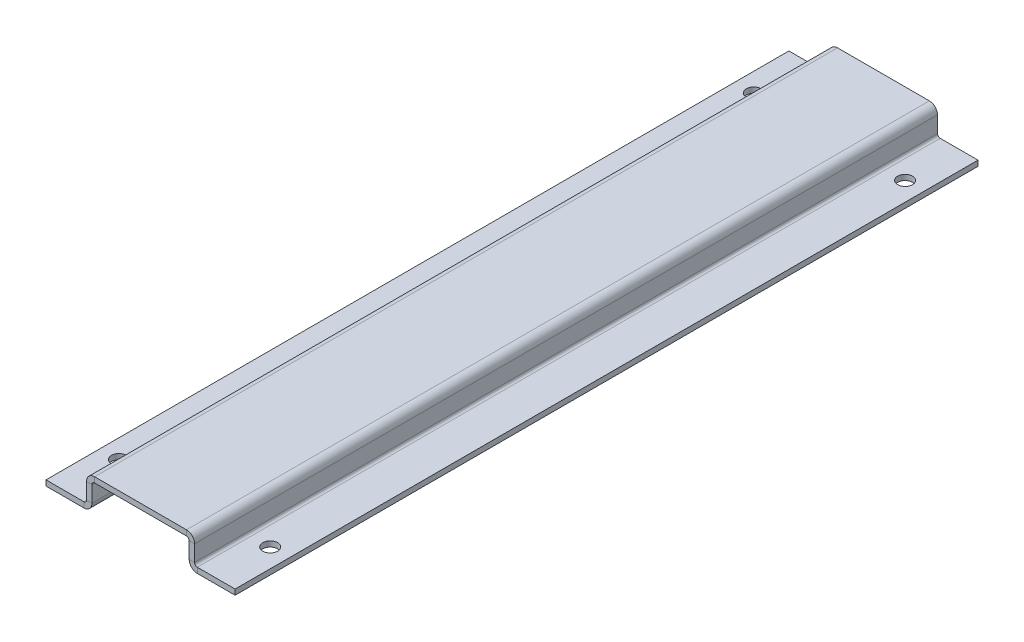
ISO-10303-21;
HEADER;
FILE_DESCRIPTION(('STEP AP214'),'2;1');
FILE_NAME('part.step','',(''),(''),'','','');
FILE_SCHEMA(('AUTOMOTIVE_DESIGN { 1 0 10303 214 1 1 1 1 }'));
ENDSEC;
DATA;
#1=APPLICATION_CONTEXT('core data for automotive mechanical design processes');
#2=APPLICATION_PROTOCOL_DEFINITION('international standard','automotive_design',2000,#1);
#3=PRODUCT_CONTEXT('',#1,'mechanical');
#4=PRODUCT('Part','Part','',(#3));
#5=PRODUCT_RELATED_PRODUCT_CATEGORY('part','',(#4));
#6=PRODUCT_DEFINITION_FORMATION('','',#4);
#7=PRODUCT_DEFINITION_CONTEXT('part definition',#1,'design');
#8=PRODUCT_DEFINITION('design','',#6,#7);
#9=PRODUCT_DEFINITION_SHAPE('','',#8);
#10=(LENGTH_UNIT() NAMED_UNIT(*) SI_UNIT(.MILLI.,.METRE.));
#11=(NAMED_UNIT(*) PLANE_ANGLE_UNIT() SI_UNIT($,.RADIAN.));
#12=(NAMED_UNIT(*) SI_UNIT($,.STERADIAN.) SOLID_ANGLE_UNIT());
#13=UNCERTAINTY_MEASURE_WITH_UNIT(LENGTH_MEASURE(1.E-05),#10,'distance_accuracy_value','');
#14=(GEOMETRIC_REPRESENTATION_CONTEXT(3) GLOBAL_UNCERTAINTY_ASSIGNED_CONTEXT((#13)) GLOBAL_UNIT_ASSIGNED_CONTEXT((#10,
#11,#12)) REPRESENTATION_CONTEXT('',''));
#15=CARTESIAN_POINT('',(0.,0.,0.));
#16=DIRECTION('',(0.,0.,1.));
#17=DIRECTION('',(1.,0.,0.));
#18=AXIS2_PLACEMENT_3D('',#15,#16,#17);
#19=CARTESIAN_POINT('',(34.9999999999999,550.712266070041,275.));
#20=DIRECTION('',(-1.,0.,0.));
#21=DIRECTION('',(0.,-1.,0.));
#22=AXIS2_PLACEMENT_3D('',#19,#20,#21);
#23=PLANE('',#22);
#24=DIRECTION('',(0.,-1.,0.));
#25=VECTOR('',#24,1.);
#26=CARTESIAN_POINT('',(34.9999999999999,550.712266070041,275.));
#27=LINE('',#26,#25);
#28=CARTESIAN_POINT('',(35.,0.,275.));
#29=VERTEX_POINT('',#28);
#30=CARTESIAN_POINT('',(35.,-2.,275.));
#31=VERTEX_POINT('',#30);
#32=EDGE_CURVE('E286',#29,#31,#27,.T.);
#33=ORIENTED_EDGE('',*,*,#32,.T.);
#34=DIRECTION('',(0.,0.,-1.));
#35=VECTOR('',#34,1.);
#36=CARTESIAN_POINT('',(35.,-2.,275.));
#37=LINE('',#36,#35);
#38=CARTESIAN_POINT('',(35.,-2.,0.));
#39=VERTEX_POINT('',#38);
#40=EDGE_CURVE('E283',#31,#39,#37,.T.);
#41=ORIENTED_EDGE('',*,*,#40,.T.);
#42=DIRECTION('',(0.,-1.,0.));
#43=VECTOR('',#42,1.);
#44=CARTESIAN_POINT('',(34.9999999999999,550.712266070041,0.));
#45=LINE('',#44,#43);
#46=CARTESIAN_POINT('',(35.,0.,0.));
#47=VERTEX_POINT('',#46);
#48=EDGE_CURVE('E271',#47,#39,#45,.T.);
#49=ORIENTED_EDGE('',*,*,#48,.F.);
#50=DIRECTION('',(0.,0.,-1.));
#51=VECTOR('',#50,1.);
#52=CARTESIAN_POINT('',(35.,0.,275.));
#53=LINE('',#52,#51);
#54=EDGE_CURVE('E11',#29,#47,#53,.T.);
#55=ORIENTED_EDGE('',*,*,#54,.F.);
#56=EDGE_LOOP('',(#33,#41,#49,#55));
#57=FACE_BOUND('',#56,.T.);
#58=ADVANCED_FACE('F36',(#57),#23,.F.);
#59=CARTESIAN_POINT('',(19.9999999999999,550.712266070041,275.));
#60=DIRECTION('',(0.,0.,-1.));
#61=DIRECTION('',(-1.,0.,0.));
#62=AXIS2_PLACEMENT_3D('',#59,#60,#61);
#63=PLANE('',#62);
#64=DIRECTION('',(0.,-1.,0.));
#65=VECTOR('',#64,1.);
#66=CARTESIAN_POINT('',(20.9999999999999,550.712266070041,275.));
#67=LINE('',#66,#65);
#68=CARTESIAN_POINT('',(21.,0.,275.));
#69=VERTEX_POINT('',#68);
#70=CARTESIAN_POINT('',(20.9999999999998,-2.00000000000001,275.));
#71=VERTEX_POINT('',#70);
#72=EDGE_CURVE('E281',#69,#71,#67,.T.);
#73=ORIENTED_EDGE('',*,*,#72,.T.);
#74=DIRECTION('',(1.,0.,0.));
#75=VECTOR('',#74,1.);
#76=CARTESIAN_POINT('',(20.,-2.,275.));
#77=LINE('',#76,#75);
#78=EDGE_CURVE('E76',#71,#31,#77,.T.);
#79=ORIENTED_EDGE('',*,*,#78,.T.);
#80=ORIENTED_EDGE('',*,*,#32,.F.);
#81=DIRECTION('',(1.,0.,0.));
#82=VECTOR('',#81,1.);
#83=CARTESIAN_POINT('',(20.,0.,275.));
#84=LINE('',#83,#82);
#85=EDGE_CURVE('E46',#69,#29,#84,.T.);
#86=ORIENTED_EDGE('',*,*,#85,.F.);
#87=EDGE_LOOP('',(#73,#79,#80,#86));
#88=FACE_BOUND('',#87,.T.);
#89=ADVANCED_FACE('F484',(#88),#63,.F.);
#90=CARTESIAN_POINT('',(20.,-2.,275.));
#91=DIRECTION('',(0.,1.,0.));
#92=DIRECTION('',(-1.,0.,0.));
#93=AXIS2_PLACEMENT_3D('',#90,#91,#92);
#94=PLANE('',#93);
#95=CARTESIAN_POINT('',(28.,-2.,20.));
#96=DIRECTION('',(0.,1.,0.));
#97=DIRECTION('',(-1.,0.,0.));
#98=AXIS2_PLACEMENT_3D('',#95,#96,#97);
#99=CIRCLE('',#98,2.74999999999995);
#100=CARTESIAN_POINT('',(25.25,-2.,20.));
#101=VERTEX_POINT('',#100);
#102=EDGE_CURVE('E519',#101,#101,#99,.F.);
#103=ORIENTED_EDGE('',*,*,#102,.F.);
#104=EDGE_LOOP('',(#103));
#105=FACE_BOUND('',#104,.T.);
#106=CARTESIAN_POINT('',(28.,-2.,255.));
#107=DIRECTION('',(0.,1.,0.));
#108=DIRECTION('',(-1.,0.,0.));
#109=AXIS2_PLACEMENT_3D('',#106,#107,#108);
#110=CIRCLE('',#109,2.75000000000003);
#111=CARTESIAN_POINT('',(25.2499999999999,-2.,255.));
#112=VERTEX_POINT('',#111);
#113=EDGE_CURVE('E527',#112,#112,#110,.F.);
#114=ORIENTED_EDGE('',*,*,#113,.F.);
#115=EDGE_LOOP('',(#114));
#116=FACE_BOUND('',#115,.T.);
#117=ORIENTED_EDGE('',*,*,#78,.F.);
#118=DIRECTION('',(0.,0.,-1.));
#119=VECTOR('',#118,1.);
#120=CARTESIAN_POINT('',(21.,-1.99999999999999,275.));
#121=LINE('',#120,#119);
#122=CARTESIAN_POINT('',(21.,-2.,0.));
#123=VERTEX_POINT('',#122);
#124=EDGE_CURVE('E278',#71,#123,#121,.T.);
#125=ORIENTED_EDGE('',*,*,#124,.T.);
#126=DIRECTION('',(1.,0.,0.));
#127=VECTOR('',#126,1.);
#128=CARTESIAN_POINT('',(20.,-1.99999999999999,0.));
#129=LINE('',#128,#127);
#130=EDGE_CURVE('E275',#123,#39,#129,.T.);
#131=ORIENTED_EDGE('',*,*,#130,.T.);
#132=ORIENTED_EDGE('',*,*,#40,.F.);
#133=EDGE_LOOP('',(#117,#125,#131,#132));
#134=FACE_BOUND('',#133,.T.);
#135=ADVANCED_FACE('F490',(#105,#116,#134),#94,.F.);
#136=CARTESIAN_POINT('',(19.9999999999999,550.712266070041,0.));
#137=DIRECTION('',(0.,0.,-1.));
#138=DIRECTION('',(-1.,0.,0.));
#139=AXIS2_PLACEMENT_3D('',#136,#137,#138);
#140=PLANE('',#139);
#141=ORIENTED_EDGE('',*,*,#130,.F.);
#142=DIRECTION('',(0.,-1.,0.));
#143=VECTOR('',#142,1.);
#144=CARTESIAN_POINT('',(20.9999999999999,550.712266070041,0.));
#145=LINE('',#144,#143);
#146=CARTESIAN_POINT('',(21.,0.,0.));
#147=VERTEX_POINT('',#146);
#148=EDGE_CURVE('E245',#147,#123,#145,.T.);
#149=ORIENTED_EDGE('',*,*,#148,.F.);
#150=DIRECTION('',(1.,0.,0.));
#151=VECTOR('',#150,1.);
#152=CARTESIAN_POINT('',(20.,0.,0.));
#153=LINE('',#152,#151);
#154=EDGE_CURVE('E273',#147,#47,#153,.T.);
#155=ORIENTED_EDGE('',*,*,#154,.T.);
#156=ORIENTED_EDGE('',*,*,#48,.T.);
#157=EDGE_LOOP('',(#141,#149,#155,#156));
#158=FACE_BOUND('',#157,.T.);
#159=ADVANCED_FACE('F496',(#158),#140,.T.);
#160=CARTESIAN_POINT('',(20.,0.,275.));
#161=DIRECTION('',(0.,1.,0.));
#162=DIRECTION('',(-1.,0.,0.));
#163=AXIS2_PLACEMENT_3D('',#160,#161,#162);
#164=PLANE('',#163);
#165=CARTESIAN_POINT('',(28.,0.,20.));
#166=DIRECTION('',(0.,1.,0.));
#167=DIRECTION('',(-1.,0.,0.));
#168=AXIS2_PLACEMENT_3D('',#165,#166,#167);
#169=CIRCLE('',#168,2.74999999999995);
#170=CARTESIAN_POINT('',(25.25,0.,20.));
#171=VERTEX_POINT('',#170);
#172=EDGE_CURVE('E523',#171,#171,#169,.T.);
#173=ORIENTED_EDGE('',*,*,#172,.F.);
#174=EDGE_LOOP('',(#173));
#175=FACE_BOUND('',#174,.T.);
#176=CARTESIAN_POINT('',(28.,0.,255.));
#177=DIRECTION('',(0.,1.,0.));
#178=DIRECTION('',(-1.,0.,0.));
#179=AXIS2_PLACEMENT_3D('',#176,#177,#178);
#180=CIRCLE('',#179,2.75000000000003);
#181=CARTESIAN_POINT('',(25.2499999999999,0.,255.));
#182=VERTEX_POINT('',#181);
#183=EDGE_CURVE('E534',#182,#182,#180,.T.);
#184=ORIENTED_EDGE('',*,*,#183,.F.);
#185=EDGE_LOOP('',(#184));
#186=FACE_BOUND('',#185,.T.);
#187=DIRECTION('',(0.,0.,-1.));
#188=VECTOR('',#187,1.);
#189=CARTESIAN_POINT('',(21.,0.,275.));
#190=LINE('',#189,#188);
#191=EDGE_CURVE('E40',#69,#147,#190,.T.);
#192=ORIENTED_EDGE('',*,*,#191,.F.);
#193=ORIENTED_EDGE('',*,*,#85,.T.);
#194=ORIENTED_EDGE('',*,*,#54,.T.);
#195=ORIENTED_EDGE('',*,*,#154,.F.);
#196=EDGE_LOOP('',(#192,#193,#194,#195));
#197=FACE_BOUND('',#196,.T.);
#198=ADVANCED_FACE('F38',(#175,#186,#197),#164,.T.);
#199=CARTESIAN_POINT('',(-530.130893515352,9.9999999999998,0.));
#200=DIRECTION('',(0.,0.,1.));
#201=DIRECTION('',(0.,-1.,0.));
#202=AXIS2_PLACEMENT_3D('',#199,#200,#201);
#203=PLANE('',#202);
#204=DIRECTION('',(0.,1.,0.));
#205=VECTOR('',#204,1.);
#206=CARTESIAN_POINT('',(20.,9.99999999999999,0.));
#207=LINE('',#206,#205);
#208=CARTESIAN_POINT('',(20.,0.999999999999994,0.));
#209=VERTEX_POINT('',#208);
#210=CARTESIAN_POINT('',(20.,7.,0.));
#211=VERTEX_POINT('',#210);
#212=EDGE_CURVE('E257',#209,#211,#207,.T.);
#213=ORIENTED_EDGE('',*,*,#212,.F.);
#214=DIRECTION('',(1.,0.,0.));
#215=VECTOR('',#214,1.);
#216=CARTESIAN_POINT('',(-530.130893515352,0.999999999999803,0.));
#217=LINE('',#216,#215);
#218=CARTESIAN_POINT('',(18.,0.999999999999994,0.));
#219=VERTEX_POINT('',#218);
#220=EDGE_CURVE('E242',#219,#209,#217,.T.);
#221=ORIENTED_EDGE('',*,*,#220,.F.);
#222=DIRECTION('',(0.,1.,0.));
#223=VECTOR('',#222,1.);
#224=CARTESIAN_POINT('',(18.,9.99999999999999,0.));
#225=LINE('',#224,#223);
#226=CARTESIAN_POINT('',(18.,7.,0.));
#227=VERTEX_POINT('',#226);
#228=EDGE_CURVE('E248',#219,#227,#225,.T.);
#229=ORIENTED_EDGE('',*,*,#228,.T.);
#230=DIRECTION('',(1.,0.,0.));
#231=VECTOR('',#230,1.);
#232=CARTESIAN_POINT('',(-530.130893515352,6.99999999999981,0.));
#233=LINE('',#232,#231);
#234=EDGE_CURVE('E253',#227,#211,#233,.T.);
#235=ORIENTED_EDGE('',*,*,#234,.T.);
#236=EDGE_LOOP('',(#213,#221,#229,#235));
#237=FACE_BOUND('',#236,.T.);
#238=ADVANCED_FACE('F256',(#237),#203,.F.);
#239=CARTESIAN_POINT('',(20.,9.99999999999999,275.));
#240=DIRECTION('',(1.,0.,0.));
#241=DIRECTION('',(0.,1.,0.));
#242=AXIS2_PLACEMENT_3D('',#239,#240,#241);
#243=PLANE('',#242);
#244=DIRECTION('',(0.,0.,1.));
#245=VECTOR('',#244,1.);
#246=CARTESIAN_POINT('',(20.,0.999999999999994,275.));
#247=LINE('',#246,#245);
#248=CARTESIAN_POINT('',(20.,0.999999999999994,275.));
#249=VERTEX_POINT('',#248);
#250=EDGE_CURVE('E259',#209,#249,#247,.T.);
#251=ORIENTED_EDGE('',*,*,#250,.F.);
#252=ORIENTED_EDGE('',*,*,#212,.T.);
#253=DIRECTION('',(0.,0.,-1.));
#254=VECTOR('',#253,1.);
#255=CARTESIAN_POINT('',(20.,7.,0.));
#256=LINE('',#255,#254);
#257=CARTESIAN_POINT('',(20.,7.,275.));
#258=VERTEX_POINT('',#257);
#259=EDGE_CURVE('E261',#258,#211,#256,.T.);
#260=ORIENTED_EDGE('',*,*,#259,.F.);
#261=DIRECTION('',(0.,-1.,0.));
#262=VECTOR('',#261,1.);
#263=CARTESIAN_POINT('',(20.,9.99999999999999,275.));
#264=LINE('',#263,#262);
#265=EDGE_CURVE('E299',#258,#249,#264,.T.);
#266=ORIENTED_EDGE('',*,*,#265,.T.);
#267=EDGE_LOOP('',(#251,#252,#260,#266));
#268=FACE_BOUND('',#267,.T.);
#269=ADVANCED_FACE('F694',(#268),#243,.T.);
#270=CARTESIAN_POINT('',(-530.130893515352,9.9999999999998,275.));
#271=DIRECTION('',(0.,0.,1.));
#272=DIRECTION('',(0.,-1.,0.));
#273=AXIS2_PLACEMENT_3D('',#270,#271,#272);
#274=PLANE('',#273);
#275=DIRECTION('',(1.,0.,0.));
#276=VECTOR('',#275,1.);
#277=CARTESIAN_POINT('',(-530.130893515352,0.999999999999803,275.));
#278=LINE('',#277,#276);
#279=CARTESIAN_POINT('',(18.,0.999999999999994,275.));
#280=VERTEX_POINT('',#279);
#281=EDGE_CURVE('E296',#280,#249,#278,.T.);
#282=ORIENTED_EDGE('',*,*,#281,.T.);
#283=ORIENTED_EDGE('',*,*,#265,.F.);
#284=DIRECTION('',(1.,0.,0.));
#285=VECTOR('',#284,1.);
#286=CARTESIAN_POINT('',(-530.130893515352,6.99999999999981,275.));
#287=LINE('',#286,#285);
#288=CARTESIAN_POINT('',(18.,7.,275.));
#289=VERTEX_POINT('',#288);
#290=EDGE_CURVE('E267',#289,#258,#287,.T.);
#291=ORIENTED_EDGE('',*,*,#290,.F.);
#292=DIRECTION('',(0.,-1.,0.));
#293=VECTOR('',#292,1.);
#294=CARTESIAN_POINT('',(18.,9.99999999999999,275.));
#295=LINE('',#294,#293);
#296=EDGE_CURVE('E98',#289,#280,#295,.T.);
#297=ORIENTED_EDGE('',*,*,#296,.T.);
#298=EDGE_LOOP('',(#282,#283,#291,#297));
#299=FACE_BOUND('',#298,.T.);
#300=ADVANCED_FACE('F688',(#299),#274,.T.);
#301=CARTESIAN_POINT('',(18.,9.99999999999999,275.));
#302=DIRECTION('',(1.,0.,0.));
#303=DIRECTION('',(0.,1.,0.));
#304=AXIS2_PLACEMENT_3D('',#301,#302,#303);
#305=PLANE('',#304);
#306=ORIENTED_EDGE('',*,*,#228,.F.);
#307=DIRECTION('',(0.,0.,1.));
#308=VECTOR('',#307,1.);
#309=CARTESIAN_POINT('',(18.,0.999999999999994,275.));
#310=LINE('',#309,#308);
#311=EDGE_CURVE('E235',#219,#280,#310,.T.);
#312=ORIENTED_EDGE('',*,*,#311,.T.);
#313=ORIENTED_EDGE('',*,*,#296,.F.);
#314=DIRECTION('',(0.,0.,-1.));
#315=VECTOR('',#314,1.);
#316=CARTESIAN_POINT('',(18.,7.,0.));
#317=LINE('',#316,#315);
#318=EDGE_CURVE('E103',#289,#227,#317,.T.);
#319=ORIENTED_EDGE('',*,*,#318,.T.);
#320=EDGE_LOOP('',(#306,#312,#313,#319));
#321=FACE_BOUND('',#320,.T.);
#322=ADVANCED_FACE('F249',(#321),#305,.F.);
#323=CARTESIAN_POINT('',(-34.9999999999998,550.712266070041,275.));
#324=DIRECTION('',(-1.,0.,0.));
#325=DIRECTION('',(0.,-1.,0.));
#326=AXIS2_PLACEMENT_3D('',#323,#324,#325);
#327=PLANE('',#326);
#328=DIRECTION('',(0.,0.,-1.));
#329=VECTOR('',#328,1.);
#330=CARTESIAN_POINT('',(-35.,-1.99999999999999,275.));
#331=LINE('',#330,#329);
#332=CARTESIAN_POINT('',(-35.,-1.99999999999999,275.));
#333=VERTEX_POINT('',#332);
#334=CARTESIAN_POINT('',(-35.,-1.99999999999999,0.));
#335=VERTEX_POINT('',#334);
#336=EDGE_CURVE('E405',#333,#335,#331,.T.);
#337=ORIENTED_EDGE('',*,*,#336,.F.);
#338=DIRECTION('',(0.,-1.,0.));
#339=VECTOR('',#338,1.);
#340=CARTESIAN_POINT('',(-34.9999999999998,550.712266070041,275.));
#341=LINE('',#340,#339);
#342=CARTESIAN_POINT('',(-35.,0.,275.));
#343=VERTEX_POINT('',#342);
#344=EDGE_CURVE('E403',#343,#333,#341,.T.);
#345=ORIENTED_EDGE('',*,*,#344,.F.);
#346=DIRECTION('',(0.,0.,-1.));
#347=VECTOR('',#346,1.);
#348=CARTESIAN_POINT('',(-35.,0.,275.));
#349=LINE('',#348,#347);
#350=CARTESIAN_POINT('',(-35.,0.,0.));
#351=VERTEX_POINT('',#350);
#352=EDGE_CURVE('E134',#343,#351,#349,.T.);
#353=ORIENTED_EDGE('',*,*,#352,.T.);
#354=DIRECTION('',(0.,-1.,0.));
#355=VECTOR('',#354,1.);
#356=CARTESIAN_POINT('',(-34.9999999999998,550.712266070041,0.));
#357=LINE('',#356,#355);
#358=EDGE_CURVE('E418',#351,#335,#357,.T.);
#359=ORIENTED_EDGE('',*,*,#358,.T.);
#360=EDGE_LOOP('',(#337,#345,#353,#359));
#361=FACE_BOUND('',#360,.T.);
#362=ADVANCED_FACE('F435',(#361),#327,.T.);
#363=CARTESIAN_POINT('',(-34.9999999999998,550.712266070041,0.));
#364=DIRECTION('',(0.,0.,-1.));
#365=DIRECTION('',(-1.,0.,0.));
#366=AXIS2_PLACEMENT_3D('',#363,#364,#365);
#367=PLANE('',#366);
#368=DIRECTION('',(1.,0.,0.));
#369=VECTOR('',#368,1.);
#370=CARTESIAN_POINT('',(-35.,-1.99999999999999,0.));
#371=LINE('',#370,#369);
#372=CARTESIAN_POINT('',(-21.,-2.,0.));
#373=VERTEX_POINT('',#372);
#374=EDGE_CURVE('E409',#335,#373,#371,.T.);
#375=ORIENTED_EDGE('',*,*,#374,.F.);
#376=ORIENTED_EDGE('',*,*,#358,.F.);
#377=DIRECTION('',(1.,0.,0.));
#378=VECTOR('',#377,1.);
#379=CARTESIAN_POINT('',(-35.,0.,0.));
#380=LINE('',#379,#378);
#381=CARTESIAN_POINT('',(-21.,0.,0.));
#382=VERTEX_POINT('',#381);
#383=EDGE_CURVE('E415',#351,#382,#380,.T.);
#384=ORIENTED_EDGE('',*,*,#383,.T.);
#385=DIRECTION('',(0.,-1.,0.));
#386=VECTOR('',#385,1.);
#387=CARTESIAN_POINT('',(-20.9999999999998,550.712266070041,0.));
#388=LINE('',#387,#386);
#389=EDGE_CURVE('E412',#382,#373,#388,.T.);
#390=ORIENTED_EDGE('',*,*,#389,.T.);
#391=EDGE_LOOP('',(#375,#376,#384,#390));
#392=FACE_BOUND('',#391,.T.);
#393=ADVANCED_FACE('F434',(#392),#367,.T.);
#394=CARTESIAN_POINT('',(-35.,-1.99999999999999,275.));
#395=DIRECTION('',(0.,1.,0.));
#396=DIRECTION('',(-1.,0.,0.));
#397=AXIS2_PLACEMENT_3D('',#394,#395,#396);
#398=PLANE('',#397);
#399=CARTESIAN_POINT('',(-28.,-1.99999999999999,255.));
#400=DIRECTION('',(0.,1.,0.));
#401=DIRECTION('',(-1.,0.,0.));
#402=AXIS2_PLACEMENT_3D('',#399,#400,#401);
#403=CIRCLE('',#402,2.75);
#404=CARTESIAN_POINT('',(-30.75,-1.99999999999999,255.));
#405=VERTEX_POINT('',#404);
#406=EDGE_CURVE('E520',#405,#405,#403,.F.);
#407=ORIENTED_EDGE('',*,*,#406,.F.);
#408=EDGE_LOOP('',(#407));
#409=FACE_BOUND('',#408,.T.);
#410=CARTESIAN_POINT('',(-28.,-1.99999999999999,20.));
#411=DIRECTION('',(0.,1.,0.));
#412=DIRECTION('',(-1.,0.,0.));
#413=AXIS2_PLACEMENT_3D('',#410,#411,#412);
#414=CIRCLE('',#413,2.74999999999995);
#415=CARTESIAN_POINT('',(-30.7499999999999,-1.99999999999999,20.));
#416=VERTEX_POINT('',#415);
#417=EDGE_CURVE('E511',#416,#416,#414,.F.);
#418=ORIENTED_EDGE('',*,*,#417,.F.);
#419=EDGE_LOOP('',(#418));
#420=FACE_BOUND('',#419,.T.);
#421=ORIENTED_EDGE('',*,*,#374,.T.);
#422=DIRECTION('',(0.,0.,1.));
#423=VECTOR('',#422,1.);
#424=CARTESIAN_POINT('',(-21.,-1.99999999999999,0.));
#425=LINE('',#424,#423);
#426=CARTESIAN_POINT('',(-21.,-2.,275.));
#427=VERTEX_POINT('',#426);
#428=EDGE_CURVE('E407',#373,#427,#425,.T.);
#429=ORIENTED_EDGE('',*,*,#428,.T.);
#430=DIRECTION('',(1.,0.,0.));
#431=VECTOR('',#430,1.);
#432=CARTESIAN_POINT('',(-35.,-1.99999999999999,275.));
#433=LINE('',#432,#431);
#434=EDGE_CURVE('E127',#333,#427,#433,.T.);
#435=ORIENTED_EDGE('',*,*,#434,.F.);
#436=ORIENTED_EDGE('',*,*,#336,.T.);
#437=EDGE_LOOP('',(#421,#429,#435,#436));
#438=FACE_BOUND('',#437,.T.);
#439=ADVANCED_FACE('F436',(#409,#420,#438),#398,.F.);
#440=CARTESIAN_POINT('',(-34.9999999999998,550.712266070041,275.));
#441=DIRECTION('',(0.,0.,-1.));
#442=DIRECTION('',(-1.,0.,0.));
#443=AXIS2_PLACEMENT_3D('',#440,#441,#442);
#444=PLANE('',#443);
#445=ORIENTED_EDGE('',*,*,#344,.T.);
#446=ORIENTED_EDGE('',*,*,#434,.T.);
#447=DIRECTION('',(0.,-1.,0.));
#448=VECTOR('',#447,1.);
#449=CARTESIAN_POINT('',(-20.9999999999998,550.712266070041,275.));
#450=LINE('',#449,#448);
#451=CARTESIAN_POINT('',(-21.,0.,275.));
#452=VERTEX_POINT('',#451);
#453=EDGE_CURVE('E420',#452,#427,#450,.T.);
#454=ORIENTED_EDGE('',*,*,#453,.F.);
#455=DIRECTION('',(1.,0.,0.));
#456=VECTOR('',#455,1.);
#457=CARTESIAN_POINT('',(-35.,0.,275.));
#458=LINE('',#457,#456);
#459=EDGE_CURVE('E112',#343,#452,#458,.T.);
#460=ORIENTED_EDGE('',*,*,#459,.F.);
#461=EDGE_LOOP('',(#445,#446,#454,#460));
#462=FACE_BOUND('',#461,.T.);
#463=ADVANCED_FACE('F430',(#462),#444,.F.);
#464=CARTESIAN_POINT('',(-35.,0.,275.));
#465=DIRECTION('',(0.,1.,0.));
#466=DIRECTION('',(-1.,0.,0.));
#467=AXIS2_PLACEMENT_3D('',#464,#465,#466);
#468=PLANE('',#467);
#469=CARTESIAN_POINT('',(-28.,0.,255.));
#470=DIRECTION('',(0.,1.,0.));
#471=DIRECTION('',(-1.,0.,0.));
#472=AXIS2_PLACEMENT_3D('',#469,#470,#471);
#473=CIRCLE('',#472,2.75);
#474=CARTESIAN_POINT('',(-30.75,0.,255.));
#475=VERTEX_POINT('',#474);
#476=EDGE_CURVE('E524',#475,#475,#473,.T.);
#477=ORIENTED_EDGE('',*,*,#476,.F.);
#478=EDGE_LOOP('',(#477));
#479=FACE_BOUND('',#478,.T.);
#480=CARTESIAN_POINT('',(-28.,0.,20.));
#481=DIRECTION('',(0.,1.,0.));
#482=DIRECTION('',(-1.,0.,0.));
#483=AXIS2_PLACEMENT_3D('',#480,#481,#482);
#484=CIRCLE('',#483,2.74999999999995);
#485=CARTESIAN_POINT('',(-30.7499999999999,0.,20.));
#486=VERTEX_POINT('',#485);
#487=EDGE_CURVE('E513',#486,#486,#484,.T.);
#488=ORIENTED_EDGE('',*,*,#487,.F.);
#489=EDGE_LOOP('',(#488));
#490=FACE_BOUND('',#489,.T.);
#491=DIRECTION('',(0.,0.,1.));
#492=VECTOR('',#491,1.);
#493=CARTESIAN_POINT('',(-21.,0.,0.));
#494=LINE('',#493,#492);
#495=EDGE_CURVE('E292',#382,#452,#494,.T.);
#496=ORIENTED_EDGE('',*,*,#495,.F.);
#497=ORIENTED_EDGE('',*,*,#383,.F.);
#498=ORIENTED_EDGE('',*,*,#352,.F.);
#499=ORIENTED_EDGE('',*,*,#459,.T.);
#500=EDGE_LOOP('',(#496,#497,#498,#499));
#501=FACE_BOUND('',#500,.T.);
#502=ADVANCED_FACE('F431',(#479,#490,#501),#468,.T.);
#503=CARTESIAN_POINT('',(530.130893515352,0.,275.));
#504=DIRECTION('',(0.,0.,1.));
#505=DIRECTION('',(0.,1.,0.));
#506=AXIS2_PLACEMENT_3D('',#503,#504,#505);
#507=PLANE('',#506);
#508=DIRECTION('',(-1.,0.,0.));
#509=VECTOR('',#508,1.);
#510=CARTESIAN_POINT('',(530.130893515352,7.,275.));
#511=LINE('',#510,#509);
#512=CARTESIAN_POINT('',(-18.,7.,275.));
#513=VERTEX_POINT('',#512);
#514=CARTESIAN_POINT('',(-20.,6.99999999999999,275.));
#515=VERTEX_POINT('',#514);
#516=EDGE_CURVE('E391',#513,#515,#511,.T.);
#517=ORIENTED_EDGE('',*,*,#516,.T.);
#518=DIRECTION('',(0.,-1.,0.));
#519=VECTOR('',#518,1.);
#520=CARTESIAN_POINT('',(-20.,0.,275.));
#521=LINE('',#520,#519);
#522=CARTESIAN_POINT('',(-20.,1.,275.));
#523=VERTEX_POINT('',#522);
#524=EDGE_CURVE('E388',#515,#523,#521,.T.);
#525=ORIENTED_EDGE('',*,*,#524,.T.);
#526=DIRECTION('',(-1.,0.,0.));
#527=VECTOR('',#526,1.);
#528=CARTESIAN_POINT('',(530.130893515352,0.999999999999997,275.));
#529=LINE('',#528,#527);
#530=CARTESIAN_POINT('',(-18.,1.,275.));
#531=VERTEX_POINT('',#530);
#532=EDGE_CURVE('E393',#531,#523,#529,.T.);
#533=ORIENTED_EDGE('',*,*,#532,.F.);
#534=DIRECTION('',(0.,-1.,0.));
#535=VECTOR('',#534,1.);
#536=CARTESIAN_POINT('',(-18.,0.,275.));
#537=LINE('',#536,#535);
#538=EDGE_CURVE('E163',#513,#531,#537,.T.);
#539=ORIENTED_EDGE('',*,*,#538,.F.);
#540=EDGE_LOOP('',(#517,#525,#533,#539));
#541=FACE_BOUND('',#540,.T.);
#542=ADVANCED_FACE('F442',(#541),#507,.T.);
#543=CARTESIAN_POINT('',(-20.,0.,275.));
#544=DIRECTION('',(-1.,0.,0.));
#545=DIRECTION('',(0.,0.,1.));
#546=AXIS2_PLACEMENT_3D('',#543,#544,#545);
#547=PLANE('',#546);
#548=DIRECTION('',(0.,0.,-1.));
#549=VECTOR('',#548,1.);
#550=CARTESIAN_POINT('',(-20.,0.999999999999997,0.));
#551=LINE('',#550,#549);
#552=CARTESIAN_POINT('',(-20.,1.,0.));
#553=VERTEX_POINT('',#552);
#554=EDGE_CURVE('E395',#523,#553,#551,.T.);
#555=ORIENTED_EDGE('',*,*,#554,.F.);
#556=ORIENTED_EDGE('',*,*,#524,.F.);
#557=DIRECTION('',(0.,0.,1.));
#558=VECTOR('',#557,1.);
#559=CARTESIAN_POINT('',(-20.,7.,275.));
#560=LINE('',#559,#558);
#561=CARTESIAN_POINT('',(-20.,7.,0.));
#562=VERTEX_POINT('',#561);
#563=EDGE_CURVE('E397',#562,#515,#560,.T.);
#564=ORIENTED_EDGE('',*,*,#563,.F.);
#565=DIRECTION('',(0.,1.,0.));
#566=VECTOR('',#565,1.);
#567=CARTESIAN_POINT('',(-20.,0.,0.));
#568=LINE('',#567,#566);
#569=EDGE_CURVE('E386',#553,#562,#568,.T.);
#570=ORIENTED_EDGE('',*,*,#569,.F.);
#571=EDGE_LOOP('',(#555,#556,#564,#570));
#572=FACE_BOUND('',#571,.T.);
#573=ADVANCED_FACE('F641',(#572),#547,.T.);
#574=CARTESIAN_POINT('',(530.130893515352,0.,0.));
#575=DIRECTION('',(0.,0.,1.));
#576=DIRECTION('',(0.,1.,0.));
#577=AXIS2_PLACEMENT_3D('',#574,#575,#576);
#578=PLANE('',#577);
#579=ORIENTED_EDGE('',*,*,#569,.T.);
#580=DIRECTION('',(-1.,0.,0.));
#581=VECTOR('',#580,1.);
#582=CARTESIAN_POINT('',(530.130893515352,7.,0.));
#583=LINE('',#582,#581);
#584=CARTESIAN_POINT('',(-18.,7.,0.));
#585=VERTEX_POINT('',#584);
#586=EDGE_CURVE('E156',#585,#562,#583,.T.);
#587=ORIENTED_EDGE('',*,*,#586,.F.);
#588=DIRECTION('',(0.,1.,0.));
#589=VECTOR('',#588,1.);
#590=CARTESIAN_POINT('',(-18.,0.,0.));
#591=LINE('',#590,#589);
#592=CARTESIAN_POINT('',(-18.,1.,0.));
#593=VERTEX_POINT('',#592);
#594=EDGE_CURVE('E377',#593,#585,#591,.T.);
#595=ORIENTED_EDGE('',*,*,#594,.F.);
#596=DIRECTION('',(-1.,0.,0.));
#597=VECTOR('',#596,1.);
#598=CARTESIAN_POINT('',(530.130893515352,0.999999999999997,0.));
#599=LINE('',#598,#597);
#600=EDGE_CURVE('E383',#593,#553,#599,.T.);
#601=ORIENTED_EDGE('',*,*,#600,.T.);
#602=EDGE_LOOP('',(#579,#587,#595,#601));
#603=FACE_BOUND('',#602,.T.);
#604=ADVANCED_FACE('F635',(#603),#578,.F.);
#605=CARTESIAN_POINT('',(-18.,0.,275.));
#606=DIRECTION('',(-1.,0.,0.));
#607=DIRECTION('',(0.,0.,1.));
#608=AXIS2_PLACEMENT_3D('',#605,#606,#607);
#609=PLANE('',#608);
#610=ORIENTED_EDGE('',*,*,#538,.T.);
#611=DIRECTION('',(0.,0.,-1.));
#612=VECTOR('',#611,1.);
#613=CARTESIAN_POINT('',(-18.,0.999999999999997,0.));
#614=LINE('',#613,#612);
#615=EDGE_CURVE('E379',#531,#593,#614,.T.);
#616=ORIENTED_EDGE('',*,*,#615,.T.);
#617=ORIENTED_EDGE('',*,*,#594,.T.);
#618=DIRECTION('',(0.,0.,1.));
#619=VECTOR('',#618,1.);
#620=CARTESIAN_POINT('',(-18.,7.,275.));
#621=LINE('',#620,#619);
#622=EDGE_CURVE('E375',#585,#513,#621,.T.);
#623=ORIENTED_EDGE('',*,*,#622,.T.);
#624=EDGE_LOOP('',(#610,#616,#617,#623));
#625=FACE_BOUND('',#624,.T.);
#626=ADVANCED_FACE('F445',(#625),#609,.F.);
#627=CARTESIAN_POINT('',(-20.,-544.187693836664,0.));
#628=DIRECTION('',(0.,0.,1.));
#629=DIRECTION('',(1.,0.,0.));
#630=AXIS2_PLACEMENT_3D('',#627,#628,#629);
#631=PLANE('',#630);
#632=DIRECTION('',(1.,0.,0.));
#633=VECTOR('',#632,1.);
#634=CARTESIAN_POINT('',(-20.,10.,0.));
#635=LINE('',#634,#633);
#636=CARTESIAN_POINT('',(-17.,10.,0.));
#637=VERTEX_POINT('',#636);
#638=CARTESIAN_POINT('',(17.,10.,0.));
#639=VERTEX_POINT('',#638);
#640=EDGE_CURVE('E346',#637,#639,#635,.T.);
#641=ORIENTED_EDGE('',*,*,#640,.T.);
#642=DIRECTION('',(0.,1.,0.));
#643=VECTOR('',#642,1.);
#644=CARTESIAN_POINT('',(17.,-544.187693836664,0.));
#645=LINE('',#644,#643);
#646=CARTESIAN_POINT('',(17.,8.,0.));
#647=VERTEX_POINT('',#646);
#648=EDGE_CURVE('E318',#647,#639,#645,.T.);
#649=ORIENTED_EDGE('',*,*,#648,.F.);
#650=DIRECTION('',(1.,0.,0.));
#651=VECTOR('',#650,1.);
#652=CARTESIAN_POINT('',(-20.,8.,0.));
#653=LINE('',#652,#651);
#654=CARTESIAN_POINT('',(-17.,8.,0.));
#655=VERTEX_POINT('',#654);
#656=EDGE_CURVE('E356',#655,#647,#653,.T.);
#657=ORIENTED_EDGE('',*,*,#656,.F.);
#658=DIRECTION('',(0.,1.,0.));
#659=VECTOR('',#658,1.);
#660=CARTESIAN_POINT('',(-17.,-544.187693836664,0.));
#661=LINE('',#660,#659);
#662=EDGE_CURVE('E179',#655,#637,#661,.T.);
#663=ORIENTED_EDGE('',*,*,#662,.T.);
#664=EDGE_LOOP('',(#641,#649,#657,#663));
#665=FACE_BOUND('',#664,.T.);
#666=ADVANCED_FACE('F458',(#665),#631,.F.);
#667=CARTESIAN_POINT('',(-20.,-544.187693836664,275.));
#668=DIRECTION('',(0.,0.,1.));
#669=DIRECTION('',(1.,0.,0.));
#670=AXIS2_PLACEMENT_3D('',#667,#668,#669);
#671=PLANE('',#670);
#672=DIRECTION('',(0.,1.,0.));
#673=VECTOR('',#672,1.);
#674=CARTESIAN_POINT('',(17.,-544.187693836664,275.));
#675=LINE('',#674,#673);
#676=CARTESIAN_POINT('',(17.,8.,275.));
#677=VERTEX_POINT('',#676);
#678=CARTESIAN_POINT('',(17.,10.,275.));
#679=VERTEX_POINT('',#678);
#680=EDGE_CURVE('E171',#677,#679,#675,.T.);
#681=ORIENTED_EDGE('',*,*,#680,.T.);
#682=DIRECTION('',(1.,0.,0.));
#683=VECTOR('',#682,1.);
#684=CARTESIAN_POINT('',(-20.,10.,275.));
#685=LINE('',#684,#683);
#686=CARTESIAN_POINT('',(-17.,10.,275.));
#687=VERTEX_POINT('',#686);
#688=EDGE_CURVE('E352',#687,#679,#685,.T.);
#689=ORIENTED_EDGE('',*,*,#688,.F.);
#690=DIRECTION('',(0.,1.,0.));
#691=VECTOR('',#690,1.);
#692=CARTESIAN_POINT('',(-17.,-544.187693836664,275.));
#693=LINE('',#692,#691);
#694=CARTESIAN_POINT('',(-17.,8.,275.));
#695=VERTEX_POINT('',#694);
#696=EDGE_CURVE('E365',#695,#687,#693,.T.);
#697=ORIENTED_EDGE('',*,*,#696,.F.);
#698=DIRECTION('',(1.,0.,0.));
#699=VECTOR('',#698,1.);
#700=CARTESIAN_POINT('',(-20.,8.,275.));
#701=LINE('',#700,#699);
#702=EDGE_CURVE('E359',#695,#677,#701,.T.);
#703=ORIENTED_EDGE('',*,*,#702,.T.);
#704=EDGE_LOOP('',(#681,#689,#697,#703));
#705=FACE_BOUND('',#704,.T.);
#706=ADVANCED_FACE('F467',(#705),#671,.T.);
#707=CARTESIAN_POINT('',(-20.,8.,275.));
#708=DIRECTION('',(0.,1.,0.));
#709=DIRECTION('',(0.,0.,1.));
#710=AXIS2_PLACEMENT_3D('',#707,#708,#709);
#711=PLANE('',#710);
#712=DIRECTION('',(0.,0.,-1.));
#713=VECTOR('',#712,1.);
#714=CARTESIAN_POINT('',(17.,8.00000000000001,0.));
#715=LINE('',#714,#713);
#716=EDGE_CURVE('E361',#677,#647,#715,.T.);
#717=ORIENTED_EDGE('',*,*,#716,.F.);
#718=ORIENTED_EDGE('',*,*,#702,.F.);
#719=DIRECTION('',(0.,0.,1.));
#720=VECTOR('',#719,1.);
#721=CARTESIAN_POINT('',(-17.,8.00000000000001,275.));
#722=LINE('',#721,#720);
#723=EDGE_CURVE('E370',#655,#695,#722,.T.);
#724=ORIENTED_EDGE('',*,*,#723,.F.);
#725=ORIENTED_EDGE('',*,*,#656,.T.);
#726=EDGE_LOOP('',(#717,#718,#724,#725));
#727=FACE_BOUND('',#726,.T.);
#728=ADVANCED_FACE('F457',(#727),#711,.F.);
#729=CARTESIAN_POINT('',(-20.,10.,275.));
#730=DIRECTION('',(0.,1.,0.));
#731=DIRECTION('',(0.,0.,1.));
#732=AXIS2_PLACEMENT_3D('',#729,#730,#731);
#733=PLANE('',#732);
#734=ORIENTED_EDGE('',*,*,#688,.T.);
#735=DIRECTION('',(0.,0.,-1.));
#736=VECTOR('',#735,1.);
#737=CARTESIAN_POINT('',(17.,10.,0.));
#738=LINE('',#737,#736);
#739=EDGE_CURVE('E354',#679,#639,#738,.T.);
#740=ORIENTED_EDGE('',*,*,#739,.T.);
#741=ORIENTED_EDGE('',*,*,#640,.F.);
#742=DIRECTION('',(0.,0.,1.));
#743=VECTOR('',#742,1.);
#744=CARTESIAN_POINT('',(-17.,10.,275.));
#745=LINE('',#744,#743);
#746=EDGE_CURVE('E373',#637,#687,#745,.T.);
#747=ORIENTED_EDGE('',*,*,#746,.T.);
#748=EDGE_LOOP('',(#734,#740,#741,#747));
#749=FACE_BOUND('',#748,.T.);
#750=ADVANCED_FACE('F466',(#749),#733,.T.);
#751=CARTESIAN_POINT('',(-17.,7.,275.));
#752=DIRECTION('',(0.,0.,1.));
#753=DIRECTION('',(1.,0.,0.));
#754=AXIS2_PLACEMENT_3D('',#751,#752,#753);
#755=PLANE('',#754);
#756=ORIENTED_EDGE('',*,*,#516,.F.);
#757=CARTESIAN_POINT('',(-17.,7.,275.));
#758=DIRECTION('',(0.,0.,-1.));
#759=DIRECTION('',(-1.,0.,0.));
#760=AXIS2_PLACEMENT_3D('',#757,#758,#759);
#761=CIRCLE('',#760,1.);
#762=EDGE_CURVE('E335',#513,#695,#761,.T.);
#763=ORIENTED_EDGE('',*,*,#762,.T.);
#764=ORIENTED_EDGE('',*,*,#696,.T.);
#765=CARTESIAN_POINT('',(-17.,7.,275.));
#766=DIRECTION('',(0.,0.,-1.));
#767=DIRECTION('',(-1.,0.,0.));
#768=AXIS2_PLACEMENT_3D('',#765,#766,#767);
#769=CIRCLE('',#768,3.);
#770=EDGE_CURVE('E339',#515,#687,#769,.T.);
#771=ORIENTED_EDGE('',*,*,#770,.F.);
#772=EDGE_LOOP('',(#756,#763,#764,#771));
#773=FACE_BOUND('',#772,.T.);
#774=ADVANCED_FACE('F453',(#773),#755,.T.);
#775=CARTESIAN_POINT('',(-17.,7.,0.));
#776=DIRECTION('',(0.,0.,-1.));
#777=DIRECTION('',(-1.,0.,0.));
#778=AXIS2_PLACEMENT_3D('',#775,#776,#777);
#779=PLANE('',#778);
#780=CARTESIAN_POINT('',(-17.,7.,0.));
#781=DIRECTION('',(0.,0.,-1.));
#782=DIRECTION('',(-1.,0.,0.));
#783=AXIS2_PLACEMENT_3D('',#780,#781,#782);
#784=CIRCLE('',#783,1.);
#785=EDGE_CURVE('E343',#655,#585,#784,.F.);
#786=ORIENTED_EDGE('',*,*,#785,.T.);
#787=ORIENTED_EDGE('',*,*,#586,.T.);
#788=CARTESIAN_POINT('',(-17.,7.,0.));
#789=DIRECTION('',(0.,0.,-1.));
#790=DIRECTION('',(-1.,0.,0.));
#791=AXIS2_PLACEMENT_3D('',#788,#789,#790);
#792=CIRCLE('',#791,3.);
#793=EDGE_CURVE('E342',#637,#562,#792,.F.);
#794=ORIENTED_EDGE('',*,*,#793,.F.);
#795=ORIENTED_EDGE('',*,*,#662,.F.);
#796=EDGE_LOOP('',(#786,#787,#794,#795));
#797=FACE_BOUND('',#796,.T.);
#798=ADVANCED_FACE('F461',(#797),#779,.T.);
#799=CARTESIAN_POINT('',(-17.,7.,563.310139470228));
#800=DIRECTION('',(0.,0.,-1.));
#801=DIRECTION('',(-1.,0.,0.));
#802=AXIS2_PLACEMENT_3D('',#799,#800,#801);
#803=CYLINDRICAL_SURFACE('',#802,3.);
#804=ORIENTED_EDGE('',*,*,#746,.F.);
#805=ORIENTED_EDGE('',*,*,#793,.T.);
#806=ORIENTED_EDGE('',*,*,#563,.T.);
#807=ORIENTED_EDGE('',*,*,#770,.T.);
#808=EDGE_LOOP('',(#804,#805,#806,#807));
#809=FACE_BOUND('',#808,.T.);
#810=ADVANCED_FACE('F464',(#809),#803,.T.);
#811=CARTESIAN_POINT('',(-17.,7.,563.310139470228));
#812=DIRECTION('',(0.,0.,-1.));
#813=DIRECTION('',(-1.,0.,0.));
#814=AXIS2_PLACEMENT_3D('',#811,#812,#813);
#815=CYLINDRICAL_SURFACE('',#814,1.);
#816=ORIENTED_EDGE('',*,*,#723,.T.);
#817=ORIENTED_EDGE('',*,*,#762,.F.);
#818=ORIENTED_EDGE('',*,*,#622,.F.);
#819=ORIENTED_EDGE('',*,*,#785,.F.);
#820=EDGE_LOOP('',(#816,#817,#818,#819));
#821=FACE_BOUND('',#820,.T.);
#822=ADVANCED_FACE('F454',(#821),#815,.F.);
#823=CARTESIAN_POINT('',(-21.,1.,275.));
#824=DIRECTION('',(0.,0.,-1.));
#825=DIRECTION('',(-1.,0.,0.));
#826=AXIS2_PLACEMENT_3D('',#823,#824,#825);
#827=PLANE('',#826);
#828=ORIENTED_EDGE('',*,*,#532,.T.);
#829=CARTESIAN_POINT('',(-21.,1.,275.));
#830=DIRECTION('',(0.,0.,1.));
#831=DIRECTION('',(1.,0.,0.));
#832=AXIS2_PLACEMENT_3D('',#829,#830,#831);
#833=CIRCLE('',#832,1.);
#834=EDGE_CURVE('E321',#452,#523,#833,.T.);
#835=ORIENTED_EDGE('',*,*,#834,.F.);
#836=ORIENTED_EDGE('',*,*,#453,.T.);
#837=CARTESIAN_POINT('',(-21.,1.,275.));
#838=DIRECTION('',(0.,0.,1.));
#839=DIRECTION('',(1.,0.,0.));
#840=AXIS2_PLACEMENT_3D('',#837,#838,#839);
#841=CIRCLE('',#840,3.);
#842=EDGE_CURVE('E330',#427,#531,#841,.T.);
#843=ORIENTED_EDGE('',*,*,#842,.T.);
#844=EDGE_LOOP('',(#828,#835,#836,#843));
#845=FACE_BOUND('',#844,.T.);
#846=ADVANCED_FACE('F441',(#845),#827,.F.);
#847=CARTESIAN_POINT('',(-21.,1.,0.));
#848=DIRECTION('',(0.,0.,1.));
#849=DIRECTION('',(1.,0.,0.));
#850=AXIS2_PLACEMENT_3D('',#847,#848,#849);
#851=PLANE('',#850);
#852=CARTESIAN_POINT('',(-21.,1.,0.));
#853=DIRECTION('',(0.,0.,1.));
#854=DIRECTION('',(1.,0.,0.));
#855=AXIS2_PLACEMENT_3D('',#852,#853,#854);
#856=CIRCLE('',#855,1.);
#857=EDGE_CURVE('E143',#553,#382,#856,.F.);
#858=ORIENTED_EDGE('',*,*,#857,.F.);
#859=ORIENTED_EDGE('',*,*,#600,.F.);
#860=CARTESIAN_POINT('',(-21.,1.,0.));
#861=DIRECTION('',(0.,0.,1.));
#862=DIRECTION('',(1.,0.,0.));
#863=AXIS2_PLACEMENT_3D('',#860,#861,#862);
#864=CIRCLE('',#863,3.);
#865=EDGE_CURVE('E333',#593,#373,#864,.F.);
#866=ORIENTED_EDGE('',*,*,#865,.T.);
#867=ORIENTED_EDGE('',*,*,#389,.F.);
#868=EDGE_LOOP('',(#858,#859,#866,#867));
#869=FACE_BOUND('',#868,.T.);
#870=ADVANCED_FACE('F746',(#869),#851,.F.);
#871=CARTESIAN_POINT('',(-21.,1.,-283.395738163242));
#872=DIRECTION('',(0.,0.,1.));
#873=DIRECTION('',(1.,0.,0.));
#874=AXIS2_PLACEMENT_3D('',#871,#872,#873);
#875=CYLINDRICAL_SURFACE('',#874,3.);
#876=ORIENTED_EDGE('',*,*,#428,.F.);
#877=ORIENTED_EDGE('',*,*,#865,.F.);
#878=ORIENTED_EDGE('',*,*,#615,.F.);
#879=ORIENTED_EDGE('',*,*,#842,.F.);
#880=EDGE_LOOP('',(#876,#877,#878,#879));
#881=FACE_BOUND('',#880,.T.);
#882=ADVANCED_FACE('F440',(#881),#875,.T.);
#883=CARTESIAN_POINT('',(-21.,1.,-283.395738163242));
#884=DIRECTION('',(0.,0.,1.));
#885=DIRECTION('',(1.,0.,0.));
#886=AXIS2_PLACEMENT_3D('',#883,#884,#885);
#887=CYLINDRICAL_SURFACE('',#886,1.);
#888=ORIENTED_EDGE('',*,*,#495,.T.);
#889=ORIENTED_EDGE('',*,*,#834,.T.);
#890=ORIENTED_EDGE('',*,*,#554,.T.);
#891=ORIENTED_EDGE('',*,*,#857,.T.);
#892=EDGE_LOOP('',(#888,#889,#890,#891));
#893=FACE_BOUND('',#892,.T.);
#894=ADVANCED_FACE('F426',(#893),#887,.F.);
#895=CARTESIAN_POINT('',(17.,7.,0.));
#896=DIRECTION('',(0.,0.,-1.));
#897=DIRECTION('',(-1.,0.,0.));
#898=AXIS2_PLACEMENT_3D('',#895,#896,#897);
#899=PLANE('',#898);
#900=ORIENTED_EDGE('',*,*,#234,.F.);
#901=CARTESIAN_POINT('',(17.,7.,0.));
#902=DIRECTION('',(0.,0.,1.));
#903=DIRECTION('',(1.,0.,0.));
#904=AXIS2_PLACEMENT_3D('',#901,#902,#903);
#905=CIRCLE('',#904,0.999999999999998);
#906=EDGE_CURVE('E324',#227,#647,#905,.T.);
#907=ORIENTED_EDGE('',*,*,#906,.T.);
#908=ORIENTED_EDGE('',*,*,#648,.T.);
#909=CARTESIAN_POINT('',(17.,7.,0.));
#910=DIRECTION('',(0.,0.,1.));
#911=DIRECTION('',(1.,0.,0.));
#912=AXIS2_PLACEMENT_3D('',#909,#910,#911);
#913=CIRCLE('',#912,3.);
#914=EDGE_CURVE('E312',#211,#639,#913,.T.);
#915=ORIENTED_EDGE('',*,*,#914,.F.);
#916=EDGE_LOOP('',(#900,#907,#908,#915));
#917=FACE_BOUND('',#916,.T.);
#918=ADVANCED_FACE('F317',(#917),#899,.T.);
#919=CARTESIAN_POINT('',(17.,7.,275.));
#920=DIRECTION('',(0.,0.,1.));
#921=DIRECTION('',(1.,0.,0.));
#922=AXIS2_PLACEMENT_3D('',#919,#920,#921);
#923=PLANE('',#922);
#924=CARTESIAN_POINT('',(17.,7.,275.));
#925=DIRECTION('',(0.,0.,1.));
#926=DIRECTION('',(1.,0.,0.));
#927=AXIS2_PLACEMENT_3D('',#924,#925,#926);
#928=CIRCLE('',#927,0.999999999999998);
#929=EDGE_CURVE('E319',#677,#289,#928,.F.);
#930=ORIENTED_EDGE('',*,*,#929,.T.);
#931=ORIENTED_EDGE('',*,*,#290,.T.);
#932=CARTESIAN_POINT('',(17.,7.,275.));
#933=DIRECTION('',(0.,0.,1.));
#934=DIRECTION('',(1.,0.,0.));
#935=AXIS2_PLACEMENT_3D('',#932,#933,#934);
#936=CIRCLE('',#935,3.);
#937=EDGE_CURVE('E314',#679,#258,#936,.F.);
#938=ORIENTED_EDGE('',*,*,#937,.F.);
#939=ORIENTED_EDGE('',*,*,#680,.F.);
#940=EDGE_LOOP('',(#930,#931,#938,#939));
#941=FACE_BOUND('',#940,.T.);
#942=ADVANCED_FACE('F470',(#941),#923,.T.);
#943=CARTESIAN_POINT('',(17.,7.,-286.17696815404));
#944=DIRECTION('',(0.,0.,1.));
#945=DIRECTION('',(1.,0.,0.));
#946=AXIS2_PLACEMENT_3D('',#943,#944,#945);
#947=CYLINDRICAL_SURFACE('',#946,3.);
#948=ORIENTED_EDGE('',*,*,#739,.F.);
#949=ORIENTED_EDGE('',*,*,#937,.T.);
#950=ORIENTED_EDGE('',*,*,#259,.T.);
#951=ORIENTED_EDGE('',*,*,#914,.T.);
#952=EDGE_LOOP('',(#948,#949,#950,#951));
#953=FACE_BOUND('',#952,.T.);
#954=ADVANCED_FACE('F311',(#953),#947,.T.);
#955=CARTESIAN_POINT('',(17.,7.,-286.17696815404));
#956=DIRECTION('',(0.,0.,1.));
#957=DIRECTION('',(1.,0.,0.));
#958=AXIS2_PLACEMENT_3D('',#955,#956,#957);
#959=CYLINDRICAL_SURFACE('',#958,0.999999999999998);
#960=ORIENTED_EDGE('',*,*,#716,.T.);
#961=ORIENTED_EDGE('',*,*,#906,.F.);
#962=ORIENTED_EDGE('',*,*,#318,.F.);
#963=ORIENTED_EDGE('',*,*,#929,.F.);
#964=EDGE_LOOP('',(#960,#961,#962,#963));
#965=FACE_BOUND('',#964,.T.);
#966=ADVANCED_FACE('F472',(#965),#959,.F.);
#967=CARTESIAN_POINT('',(21.,0.999999999999994,0.));
#968=DIRECTION('',(0.,0.,1.));
#969=DIRECTION('',(1.,0.,0.));
#970=AXIS2_PLACEMENT_3D('',#967,#968,#969);
#971=PLANE('',#970);
#972=ORIENTED_EDGE('',*,*,#220,.T.);
#973=CARTESIAN_POINT('',(21.,0.999999999999994,0.));
#974=DIRECTION('',(0.,0.,-1.));
#975=DIRECTION('',(-1.,0.,0.));
#976=AXIS2_PLACEMENT_3D('',#973,#974,#975);
#977=CIRCLE('',#976,1.);
#978=EDGE_CURVE('E510',#147,#209,#977,.T.);
#979=ORIENTED_EDGE('',*,*,#978,.F.);
#980=ORIENTED_EDGE('',*,*,#148,.T.);
#981=CARTESIAN_POINT('',(21.,0.999999999999994,0.));
#982=DIRECTION('',(0.,0.,-1.));
#983=DIRECTION('',(-1.,0.,0.));
#984=AXIS2_PLACEMENT_3D('',#981,#982,#983);
#985=CIRCLE('',#984,3.);
#986=EDGE_CURVE('E68',#123,#219,#985,.T.);
#987=ORIENTED_EDGE('',*,*,#986,.T.);
#988=EDGE_LOOP('',(#972,#979,#980,#987));
#989=FACE_BOUND('',#988,.T.);
#990=ADVANCED_FACE('F240',(#989),#971,.F.);
#991=CARTESIAN_POINT('',(21.,0.999999999999994,275.));
#992=DIRECTION('',(0.,0.,-1.));
#993=DIRECTION('',(-1.,0.,0.));
#994=AXIS2_PLACEMENT_3D('',#991,#992,#993);
#995=PLANE('',#994);
#996=CARTESIAN_POINT('',(21.,0.999999999999994,275.));
#997=DIRECTION('',(0.,0.,-1.));
#998=DIRECTION('',(-1.,0.,0.));
#999=AXIS2_PLACEMENT_3D('',#996,#997,#998);
#1000=CIRCLE('',#999,1.);
#1001=EDGE_CURVE('E85',#249,#69,#1000,.F.);
#1002=ORIENTED_EDGE('',*,*,#1001,.F.);
#1003=ORIENTED_EDGE('',*,*,#281,.F.);
#1004=CARTESIAN_POINT('',(21.,0.999999999999994,275.));
#1005=DIRECTION('',(0.,0.,-1.));
#1006=DIRECTION('',(-1.,0.,0.));
#1007=AXIS2_PLACEMENT_3D('',#1004,#1005,#1006);
#1008=CIRCLE('',#1007,3.);
#1009=EDGE_CURVE('E237',#280,#71,#1008,.F.);
#1010=ORIENTED_EDGE('',*,*,#1009,.T.);
#1011=ORIENTED_EDGE('',*,*,#72,.F.);
#1012=EDGE_LOOP('',(#1002,#1003,#1010,#1011));
#1013=FACE_BOUND('',#1012,.T.);
#1014=ADVANCED_FACE('F479',(#1013),#995,.F.);
#1015=CARTESIAN_POINT('',(21.,0.999999999999994,556.661823587199));
#1016=DIRECTION('',(0.,0.,-1.));
#1017=DIRECTION('',(-1.,0.,0.));
#1018=AXIS2_PLACEMENT_3D('',#1015,#1016,#1017);
#1019=CYLINDRICAL_SURFACE('',#1018,3.);
#1020=ORIENTED_EDGE('',*,*,#124,.F.);
#1021=ORIENTED_EDGE('',*,*,#1009,.F.);
#1022=ORIENTED_EDGE('',*,*,#311,.F.);
#1023=ORIENTED_EDGE('',*,*,#986,.F.);
#1024=EDGE_LOOP('',(#1020,#1021,#1022,#1023));
#1025=FACE_BOUND('',#1024,.T.);
#1026=ADVANCED_FACE('F236',(#1025),#1019,.T.);
#1027=CARTESIAN_POINT('',(21.,0.999999999999994,556.661823587199));
#1028=DIRECTION('',(0.,0.,-1.));
#1029=DIRECTION('',(-1.,0.,0.));
#1030=AXIS2_PLACEMENT_3D('',#1027,#1028,#1029);
#1031=CYLINDRICAL_SURFACE('',#1030,1.);
#1032=ORIENTED_EDGE('',*,*,#191,.T.);
#1033=ORIENTED_EDGE('',*,*,#978,.T.);
#1034=ORIENTED_EDGE('',*,*,#250,.T.);
#1035=ORIENTED_EDGE('',*,*,#1001,.T.);
#1036=EDGE_LOOP('',(#1032,#1033,#1034,#1035));
#1037=FACE_BOUND('',#1036,.T.);
#1038=ADVANCED_FACE('F509',(#1037),#1031,.F.);
#1039=CARTESIAN_POINT('',(-28.,-2.00100000000001,20.));
#1040=DIRECTION('',(0.,1.,0.));
#1041=DIRECTION('',(-1.,0.,0.));
#1042=AXIS2_PLACEMENT_3D('',#1039,#1040,#1041);
#1043=CYLINDRICAL_SURFACE('',#1042,2.74999999999995);
#1044=ORIENTED_EDGE('',*,*,#487,.T.);
#1045=EDGE_LOOP('',(#1044));
#1046=FACE_BOUND('',#1045,.T.);
#1047=ORIENTED_EDGE('',*,*,#417,.T.);
#1048=EDGE_LOOP('',(#1047));
#1049=FACE_BOUND('',#1048,.T.);
#1050=ADVANCED_FACE('F553',(#1046,#1049),#1043,.F.);
#1051=CARTESIAN_POINT('',(-28.,-2.00100000000001,255.));
#1052=DIRECTION('',(0.,1.,0.));
#1053=DIRECTION('',(-1.,0.,0.));
#1054=AXIS2_PLACEMENT_3D('',#1051,#1052,#1053);
#1055=CYLINDRICAL_SURFACE('',#1054,2.75);
#1056=ORIENTED_EDGE('',*,*,#476,.T.);
#1057=EDGE_LOOP('',(#1056));
#1058=FACE_BOUND('',#1057,.T.);
#1059=ORIENTED_EDGE('',*,*,#406,.T.);
#1060=EDGE_LOOP('',(#1059));
#1061=FACE_BOUND('',#1060,.T.);
#1062=ADVANCED_FACE('F543',(#1058,#1061),#1055,.F.);
#1063=CARTESIAN_POINT('',(28.,-2.00100000000003,255.));
#1064=DIRECTION('',(0.,1.,0.));
#1065=DIRECTION('',(-1.,0.,0.));
#1066=AXIS2_PLACEMENT_3D('',#1063,#1064,#1065);
#1067=CYLINDRICAL_SURFACE('',#1066,2.75000000000003);
#1068=ORIENTED_EDGE('',*,*,#183,.T.);
#1069=EDGE_LOOP('',(#1068));
#1070=FACE_BOUND('',#1069,.T.);
#1071=ORIENTED_EDGE('',*,*,#113,.T.);
#1072=EDGE_LOOP('',(#1071));
#1073=FACE_BOUND('',#1072,.T.);
#1074=ADVANCED_FACE('F538',(#1070,#1073),#1067,.F.);
#1075=CARTESIAN_POINT('',(28.,-2.00100000000003,20.));
#1076=DIRECTION('',(0.,1.,0.));
#1077=DIRECTION('',(-1.,0.,0.));
#1078=AXIS2_PLACEMENT_3D('',#1075,#1076,#1077);
#1079=CYLINDRICAL_SURFACE('',#1078,2.74999999999995);
#1080=ORIENTED_EDGE('',*,*,#172,.T.);
#1081=EDGE_LOOP('',(#1080));
#1082=FACE_BOUND('',#1081,.T.);
#1083=ORIENTED_EDGE('',*,*,#102,.T.);
#1084=EDGE_LOOP('',(#1083));
#1085=FACE_BOUND('',#1084,.T.);
#1086=ADVANCED_FACE('F542',(#1082,#1085),#1079,.F.);
#1087=CLOSED_SHELL('',(#58,#89,#135,#159,#198,#238,#269,#300,#322,#362,#393,#439,#463,#502,#542,
#573,#604,#626,#666,#706,#728,#750,#774,#798,#810,#822,#846,#870,#882,#894,#918,#942,#954,#966,
#990,#1014,#1026,#1038,#1050,#1062,#1074,#1086));
#1088=MANIFOLD_SOLID_BREP('B2',#1087);
#1089=ADVANCED_BREP_SHAPE_REPRESENTATION('',(#18,#1088),#14);
#1090=SHAPE_DEFINITION_REPRESENTATION(#9,#1089);
ENDSEC;
END-ISO-10303-21;
